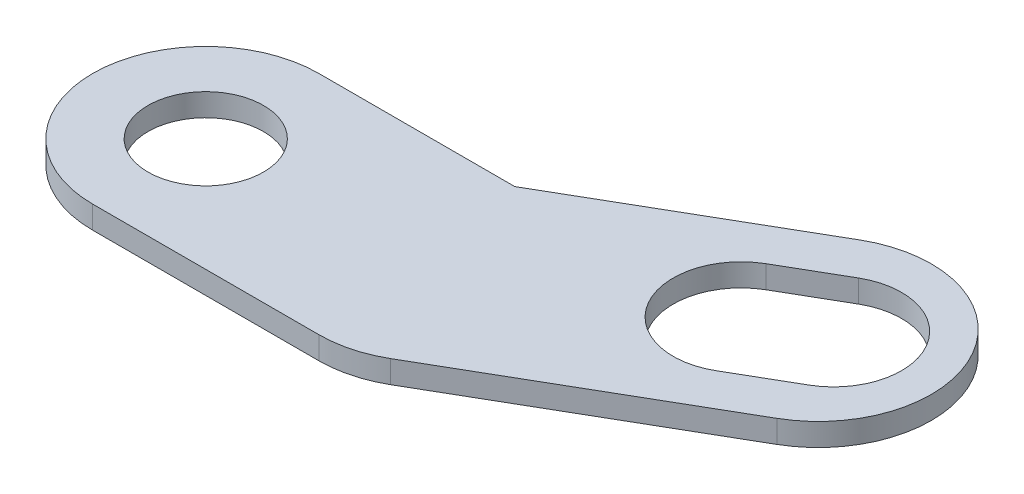
ISO-10303-21;
HEADER;
FILE_DESCRIPTION(('STEP AP214'),'2;1');
FILE_NAME('part.step','',(''),(''),'','','');
FILE_SCHEMA(('AUTOMOTIVE_DESIGN { 1 0 10303 214 1 1 1 1 }'));
ENDSEC;
DATA;
#1=APPLICATION_CONTEXT('core data for automotive mechanical design processes');
#2=APPLICATION_PROTOCOL_DEFINITION('international standard','automotive_design',2000,#1);
#3=PRODUCT_CONTEXT('',#1,'mechanical');
#4=PRODUCT('Part','Part','',(#3));
#5=PRODUCT_RELATED_PRODUCT_CATEGORY('part','',(#4));
#6=PRODUCT_DEFINITION_FORMATION('','',#4);
#7=PRODUCT_DEFINITION_CONTEXT('part definition',#1,'design');
#8=PRODUCT_DEFINITION('design','',#6,#7);
#9=PRODUCT_DEFINITION_SHAPE('','',#8);
#10=(LENGTH_UNIT() NAMED_UNIT(*) SI_UNIT(.MILLI.,.METRE.));
#11=(NAMED_UNIT(*) PLANE_ANGLE_UNIT() SI_UNIT($,.RADIAN.));
#12=(NAMED_UNIT(*) SI_UNIT($,.STERADIAN.) SOLID_ANGLE_UNIT());
#13=UNCERTAINTY_MEASURE_WITH_UNIT(LENGTH_MEASURE(1.E-05),#10,'distance_accuracy_value','');
#14=(GEOMETRIC_REPRESENTATION_CONTEXT(3) GLOBAL_UNCERTAINTY_ASSIGNED_CONTEXT((#13)) GLOBAL_UNIT_ASSIGNED_CONTEXT((#10,
#11,#12)) REPRESENTATION_CONTEXT('',''));
#15=CARTESIAN_POINT('',(0.,0.,0.));
#16=DIRECTION('',(0.,0.,1.));
#17=DIRECTION('',(1.,0.,0.));
#18=AXIS2_PLACEMENT_3D('',#15,#16,#17);
#19=CARTESIAN_POINT('',(10.6602540378444,1.,-5.00000000000002));
#20=DIRECTION('',(0.,1.,0.));
#21=DIRECTION('',(0.,0.,1.));
#22=AXIS2_PLACEMENT_3D('',#19,#20,#21);
#23=CYLINDRICAL_SURFACE('',#22,3.);
#24=DIRECTION('',(0.,1.,0.));
#25=VECTOR('',#24,1.);
#26=CARTESIAN_POINT('',(12.1602540378444,1.,-2.4019237886467));
#27=LINE('',#26,#25);
#28=CARTESIAN_POINT('',(12.1602540378444,0.,-2.4019237886467));
#29=VERTEX_POINT('',#28);
#30=CARTESIAN_POINT('',(12.1602540378444,1.,-2.4019237886467));
#31=VERTEX_POINT('',#30);
#32=EDGE_CURVE('E13',#29,#31,#27,.T.);
#33=ORIENTED_EDGE('',*,*,#32,.F.);
#34=CARTESIAN_POINT('',(10.6602540378444,0.,-5.00000000000002));
#35=DIRECTION('',(0.,1.,0.));
#36=DIRECTION('',(0.,0.,1.));
#37=AXIS2_PLACEMENT_3D('',#34,#35,#36);
#38=CIRCLE('',#37,3.);
#39=CARTESIAN_POINT('',(9.16025403784438,0.,-7.59807621135333));
#40=VERTEX_POINT('',#39);
#41=EDGE_CURVE('E126',#40,#29,#38,.T.);
#42=ORIENTED_EDGE('',*,*,#41,.F.);
#43=DIRECTION('',(0.,1.,0.));
#44=VECTOR('',#43,1.);
#45=CARTESIAN_POINT('',(9.16025403784438,1.,-7.59807621135333));
#46=LINE('',#45,#44);
#47=CARTESIAN_POINT('',(9.16025403784438,1.,-7.59807621135333));
#48=VERTEX_POINT('',#47);
#49=EDGE_CURVE('E60',#40,#48,#46,.T.);
#50=ORIENTED_EDGE('',*,*,#49,.T.);
#51=CARTESIAN_POINT('',(10.6602540378444,1.,-5.00000000000002));
#52=DIRECTION('',(0.,1.,0.));
#53=DIRECTION('',(0.,0.,1.));
#54=AXIS2_PLACEMENT_3D('',#51,#52,#53);
#55=CIRCLE('',#54,3.);
#56=EDGE_CURVE('E165',#48,#31,#55,.T.);
#57=ORIENTED_EDGE('',*,*,#56,.T.);
#58=EDGE_LOOP('',(#33,#42,#50,#57));
#59=FACE_BOUND('',#58,.T.);
#60=ADVANCED_FACE('F50',(#59),#23,.F.);
#61=CARTESIAN_POINT('',(-1.00000000000001,1.,-1.73205080756888));
#62=DIRECTION('',(0.500000000000001,0.,0.866025403784438));
#63=DIRECTION('',(0.866025403784438,0.,-0.500000000000001));
#64=AXIS2_PLACEMENT_3D('',#61,#62,#63);
#65=PLANE('',#64);
#66=ORIENTED_EDGE('',*,*,#49,.F.);
#67=DIRECTION('',(0.866025403784438,0.,-0.500000000000001));
#68=VECTOR('',#67,1.);
#69=CARTESIAN_POINT('',(-1.00000000000001,0.,-1.73205080756888));
#70=LINE('',#69,#68);
#71=CARTESIAN_POINT('',(11.7583302491977,0.,-9.09807621135333));
#72=VERTEX_POINT('',#71);
#73=EDGE_CURVE('E138',#40,#72,#70,.T.);
#74=ORIENTED_EDGE('',*,*,#73,.T.);
#75=DIRECTION('',(0.,1.,0.));
#76=VECTOR('',#75,1.);
#77=CARTESIAN_POINT('',(11.7583302491977,1.,-9.09807621135333));
#78=LINE('',#77,#76);
#79=CARTESIAN_POINT('',(11.7583302491977,1.,-9.09807621135333));
#80=VERTEX_POINT('',#79);
#81=EDGE_CURVE('E68',#72,#80,#78,.T.);
#82=ORIENTED_EDGE('',*,*,#81,.T.);
#83=DIRECTION('',(0.866025403784438,0.,-0.500000000000001));
#84=VECTOR('',#83,1.);
#85=CARTESIAN_POINT('',(-1.00000000000001,1.,-1.73205080756888));
#86=LINE('',#85,#84);
#87=EDGE_CURVE('E162',#48,#80,#86,.T.);
#88=ORIENTED_EDGE('',*,*,#87,.F.);
#89=EDGE_LOOP('',(#66,#74,#82,#88));
#90=FACE_BOUND('',#89,.T.);
#91=ADVANCED_FACE('F170',(#90),#65,.T.);
#92=CARTESIAN_POINT('',(13.2583302491977,1.,-6.50000000000002));
#93=DIRECTION('',(0.,1.,0.));
#94=DIRECTION('',(0.,0.,1.));
#95=AXIS2_PLACEMENT_3D('',#92,#93,#94);
#96=CYLINDRICAL_SURFACE('',#95,3.);
#97=ORIENTED_EDGE('',*,*,#81,.F.);
#98=CARTESIAN_POINT('',(13.2583302491977,0.,-6.50000000000002));
#99=DIRECTION('',(0.,1.,0.));
#100=DIRECTION('',(0.,0.,1.));
#101=AXIS2_PLACEMENT_3D('',#98,#99,#100);
#102=CIRCLE('',#101,3.);
#103=CARTESIAN_POINT('',(14.7583302491977,0.,-3.9019237886467));
#104=VERTEX_POINT('',#103);
#105=EDGE_CURVE('E125',#104,#72,#102,.T.);
#106=ORIENTED_EDGE('',*,*,#105,.F.);
#107=DIRECTION('',(0.,1.,0.));
#108=VECTOR('',#107,1.);
#109=CARTESIAN_POINT('',(14.7583302491977,1.,-3.9019237886467));
#110=LINE('',#109,#108);
#111=CARTESIAN_POINT('',(14.7583302491977,1.,-3.9019237886467));
#112=VERTEX_POINT('',#111);
#113=EDGE_CURVE('E54',#104,#112,#110,.T.);
#114=ORIENTED_EDGE('',*,*,#113,.T.);
#115=CARTESIAN_POINT('',(13.2583302491977,1.,-6.50000000000002));
#116=DIRECTION('',(0.,1.,0.));
#117=DIRECTION('',(0.,0.,1.));
#118=AXIS2_PLACEMENT_3D('',#115,#116,#117);
#119=CIRCLE('',#118,3.);
#120=EDGE_CURVE('E245',#112,#80,#119,.T.);
#121=ORIENTED_EDGE('',*,*,#120,.T.);
#122=EDGE_LOOP('',(#97,#106,#114,#121));
#123=FACE_BOUND('',#122,.T.);
#124=ADVANCED_FACE('F128',(#123),#96,.F.);
#125=CARTESIAN_POINT('',(3.00000000000001,1.,5.19615242270663));
#126=DIRECTION('',(0.500000000000001,0.,0.866025403784438));
#127=DIRECTION('',(0.866025403784438,0.,-0.500000000000001));
#128=AXIS2_PLACEMENT_3D('',#125,#126,#127);
#129=PLANE('',#128);
#130=DIRECTION('',(0.,1.,0.));
#131=VECTOR('',#130,1.);
#132=CARTESIAN_POINT('',(4.50000000000001,1.,4.33012701892219));
#133=LINE('',#132,#131);
#134=CARTESIAN_POINT('',(4.50000000000001,0.,4.33012701892219));
#135=VERTEX_POINT('',#134);
#136=CARTESIAN_POINT('',(4.50000000000001,1.,4.33012701892219));
#137=VERTEX_POINT('',#136);
#138=EDGE_CURVE('E120',#135,#137,#133,.T.);
#139=ORIENTED_EDGE('',*,*,#138,.F.);
#140=DIRECTION('',(0.866025403784438,0.,-0.500000000000001));
#141=VECTOR('',#140,1.);
#142=CARTESIAN_POINT('',(3.00000000000001,0.,5.19615242270663));
#143=LINE('',#142,#141);
#144=CARTESIAN_POINT('',(15.3253175473055,0.,-1.91987298107783));
#145=VERTEX_POINT('',#144);
#146=EDGE_CURVE('E185',#135,#145,#143,.T.);
#147=ORIENTED_EDGE('',*,*,#146,.T.);
#148=DIRECTION('',(0.,1.,0.));
#149=VECTOR('',#148,1.);
#150=CARTESIAN_POINT('',(15.3253175473055,1.,-1.91987298107783));
#151=LINE('',#150,#149);
#152=CARTESIAN_POINT('',(15.3253175473055,1.,-1.91987298107783));
#153=VERTEX_POINT('',#152);
#154=EDGE_CURVE('E155',#145,#153,#151,.T.);
#155=ORIENTED_EDGE('',*,*,#154,.T.);
#156=DIRECTION('',(0.866025403784438,0.,-0.500000000000001));
#157=VECTOR('',#156,1.);
#158=CARTESIAN_POINT('',(3.00000000000001,1.,5.19615242270663));
#159=LINE('',#158,#157);
#160=EDGE_CURVE('E225',#137,#153,#159,.T.);
#161=ORIENTED_EDGE('',*,*,#160,.F.);
#162=EDGE_LOOP('',(#139,#147,#155,#161));
#163=FACE_BOUND('',#162,.T.);
#164=ADVANCED_FACE('F224',(#163),#129,.T.);
#165=CARTESIAN_POINT('',(12.8253175473055,1.,-6.25000000000002));
#166=DIRECTION('',(0.,1.,0.));
#167=DIRECTION('',(0.,0.,1.));
#168=AXIS2_PLACEMENT_3D('',#165,#166,#167);
#169=CYLINDRICAL_SURFACE('',#168,5.);
#170=ORIENTED_EDGE('',*,*,#154,.F.);
#171=CARTESIAN_POINT('',(12.8253175473055,0.,-6.25000000000002));
#172=DIRECTION('',(0.,1.,0.));
#173=DIRECTION('',(0.,0.,1.));
#174=AXIS2_PLACEMENT_3D('',#171,#172,#173);
#175=CIRCLE('',#174,5.);
#176=CARTESIAN_POINT('',(10.3253175473055,0.,-10.5801270189222));
#177=VERTEX_POINT('',#176);
#178=EDGE_CURVE('E183',#145,#177,#175,.T.);
#179=ORIENTED_EDGE('',*,*,#178,.T.);
#180=DIRECTION('',(0.,1.,0.));
#181=VECTOR('',#180,1.);
#182=CARTESIAN_POINT('',(10.3253175473055,1.,-10.5801270189222));
#183=LINE('',#182,#181);
#184=CARTESIAN_POINT('',(10.3253175473055,1.,-10.5801270189222));
#185=VERTEX_POINT('',#184);
#186=EDGE_CURVE('E152',#177,#185,#183,.T.);
#187=ORIENTED_EDGE('',*,*,#186,.T.);
#188=CARTESIAN_POINT('',(12.8253175473055,1.,-6.25000000000002));
#189=DIRECTION('',(0.,1.,0.));
#190=DIRECTION('',(0.,0.,1.));
#191=AXIS2_PLACEMENT_3D('',#188,#189,#190);
#192=CIRCLE('',#191,5.);
#193=EDGE_CURVE('E231',#153,#185,#192,.T.);
#194=ORIENTED_EDGE('',*,*,#193,.F.);
#195=EDGE_LOOP('',(#170,#179,#187,#194));
#196=FACE_BOUND('',#195,.T.);
#197=ADVANCED_FACE('F235',(#196),#169,.T.);
#198=CARTESIAN_POINT('',(-2.00000000000001,1.,-3.46410161513775));
#199=DIRECTION('',(0.500000000000001,0.,0.866025403784438));
#200=DIRECTION('',(0.866025403784438,0.,-0.500000000000001));
#201=AXIS2_PLACEMENT_3D('',#198,#199,#200);
#202=PLANE('',#201);
#203=ORIENTED_EDGE('',*,*,#186,.F.);
#204=DIRECTION('',(0.866025403784438,0.,-0.500000000000001));
#205=VECTOR('',#204,1.);
#206=CARTESIAN_POINT('',(-2.00000000000001,0.,-3.46410161513775));
#207=LINE('',#206,#205);
#208=CARTESIAN_POINT('',(0.660254037844382,0.,-5.));
#209=VERTEX_POINT('',#208);
#210=EDGE_CURVE('E180',#209,#177,#207,.T.);
#211=ORIENTED_EDGE('',*,*,#210,.F.);
#212=DIRECTION('',(0.,1.,0.));
#213=VECTOR('',#212,1.);
#214=CARTESIAN_POINT('',(0.660254037844382,1.,-5.));
#215=LINE('',#214,#213);
#216=CARTESIAN_POINT('',(0.660254037844382,1.,-5.));
#217=VERTEX_POINT('',#216);
#218=EDGE_CURVE('E149',#209,#217,#215,.T.);
#219=ORIENTED_EDGE('',*,*,#218,.T.);
#220=DIRECTION('',(0.866025403784438,0.,-0.500000000000001));
#221=VECTOR('',#220,1.);
#222=CARTESIAN_POINT('',(-2.00000000000001,1.,-3.46410161513775));
#223=LINE('',#222,#221);
#224=EDGE_CURVE('E236',#217,#185,#223,.T.);
#225=ORIENTED_EDGE('',*,*,#224,.T.);
#226=EDGE_LOOP('',(#203,#211,#219,#225));
#227=FACE_BOUND('',#226,.T.);
#228=ADVANCED_FACE('F252',(#227),#202,.F.);
#229=CARTESIAN_POINT('',(0.,1.,-5.));
#230=DIRECTION('',(0.,0.,1.));
#231=DIRECTION('',(1.,0.,0.));
#232=AXIS2_PLACEMENT_3D('',#229,#230,#231);
#233=PLANE('',#232);
#234=ORIENTED_EDGE('',*,*,#218,.F.);
#235=DIRECTION('',(1.,0.,0.));
#236=VECTOR('',#235,1.);
#237=CARTESIAN_POINT('',(0.,0.,-5.));
#238=LINE('',#237,#236);
#239=CARTESIAN_POINT('',(-8.,0.,-5.));
#240=VERTEX_POINT('',#239);
#241=EDGE_CURVE('E132',#240,#209,#238,.T.);
#242=ORIENTED_EDGE('',*,*,#241,.F.);
#243=DIRECTION('',(0.,1.,0.));
#244=VECTOR('',#243,1.);
#245=CARTESIAN_POINT('',(-8.,1.,-5.));
#246=LINE('',#245,#244);
#247=CARTESIAN_POINT('',(-8.,1.,-5.));
#248=VERTEX_POINT('',#247);
#249=EDGE_CURVE('E145',#240,#248,#246,.T.);
#250=ORIENTED_EDGE('',*,*,#249,.T.);
#251=DIRECTION('',(1.,0.,0.));
#252=VECTOR('',#251,1.);
#253=CARTESIAN_POINT('',(0.,1.,-5.));
#254=LINE('',#253,#252);
#255=EDGE_CURVE('E238',#248,#217,#254,.T.);
#256=ORIENTED_EDGE('',*,*,#255,.T.);
#257=EDGE_LOOP('',(#234,#242,#250,#256));
#258=FACE_BOUND('',#257,.T.);
#259=ADVANCED_FACE('F248',(#258),#233,.F.);
#260=CARTESIAN_POINT('',(-8.,1.,0.));
#261=DIRECTION('',(0.,1.,0.));
#262=DIRECTION('',(0.,0.,1.));
#263=AXIS2_PLACEMENT_3D('',#260,#261,#262);
#264=CYLINDRICAL_SURFACE('',#263,5.);
#265=ORIENTED_EDGE('',*,*,#249,.F.);
#266=CARTESIAN_POINT('',(-8.,0.,0.));
#267=DIRECTION('',(0.,1.,0.));
#268=DIRECTION('',(0.,0.,1.));
#269=AXIS2_PLACEMENT_3D('',#266,#267,#268);
#270=CIRCLE('',#269,5.);
#271=CARTESIAN_POINT('',(-8.,0.,5.));
#272=VERTEX_POINT('',#271);
#273=EDGE_CURVE('E129',#240,#272,#270,.T.);
#274=ORIENTED_EDGE('',*,*,#273,.T.);
#275=DIRECTION('',(0.,1.,0.));
#276=VECTOR('',#275,1.);
#277=CARTESIAN_POINT('',(-8.,1.,5.));
#278=LINE('',#277,#276);
#279=CARTESIAN_POINT('',(-8.,1.,5.));
#280=VERTEX_POINT('',#279);
#281=EDGE_CURVE('E142',#272,#280,#278,.T.);
#282=ORIENTED_EDGE('',*,*,#281,.T.);
#283=CARTESIAN_POINT('',(-8.,1.,0.));
#284=DIRECTION('',(0.,1.,0.));
#285=DIRECTION('',(0.,0.,1.));
#286=AXIS2_PLACEMENT_3D('',#283,#284,#285);
#287=CIRCLE('',#286,5.);
#288=EDGE_CURVE('E210',#248,#280,#287,.T.);
#289=ORIENTED_EDGE('',*,*,#288,.F.);
#290=EDGE_LOOP('',(#265,#274,#282,#289));
#291=FACE_BOUND('',#290,.T.);
#292=ADVANCED_FACE('F208',(#291),#264,.T.);
#293=CARTESIAN_POINT('',(0.,1.,5.));
#294=DIRECTION('',(0.,0.,1.));
#295=DIRECTION('',(1.,0.,0.));
#296=AXIS2_PLACEMENT_3D('',#293,#294,#295);
#297=PLANE('',#296);
#298=ORIENTED_EDGE('',*,*,#281,.F.);
#299=DIRECTION('',(1.,0.,0.));
#300=VECTOR('',#299,1.);
#301=CARTESIAN_POINT('',(0.,0.,5.));
#302=LINE('',#301,#300);
#303=CARTESIAN_POINT('',(2.,0.,5.));
#304=VERTEX_POINT('',#303);
#305=EDGE_CURVE('E174',#272,#304,#302,.T.);
#306=ORIENTED_EDGE('',*,*,#305,.T.);
#307=DIRECTION('',(0.,1.,0.));
#308=VECTOR('',#307,1.);
#309=CARTESIAN_POINT('',(2.,1.,5.));
#310=LINE('',#309,#308);
#311=CARTESIAN_POINT('',(2.,1.,5.));
#312=VERTEX_POINT('',#311);
#313=EDGE_CURVE('E146',#304,#312,#310,.T.);
#314=ORIENTED_EDGE('',*,*,#313,.T.);
#315=DIRECTION('',(1.,0.,0.));
#316=VECTOR('',#315,1.);
#317=CARTESIAN_POINT('',(0.,1.,5.));
#318=LINE('',#317,#316);
#319=EDGE_CURVE('E140',#280,#312,#318,.T.);
#320=ORIENTED_EDGE('',*,*,#319,.F.);
#321=EDGE_LOOP('',(#298,#306,#314,#320));
#322=FACE_BOUND('',#321,.T.);
#323=ADVANCED_FACE('F201',(#322),#297,.T.);
#324=CARTESIAN_POINT('',(2.,1.,0.));
#325=DIRECTION('',(0.,1.,0.));
#326=DIRECTION('',(0.,0.,1.));
#327=AXIS2_PLACEMENT_3D('',#324,#325,#326);
#328=CYLINDRICAL_SURFACE('',#327,5.);
#329=CARTESIAN_POINT('',(2.,0.,0.));
#330=DIRECTION('',(0.,1.,0.));
#331=DIRECTION('',(0.,0.,1.));
#332=AXIS2_PLACEMENT_3D('',#329,#330,#331);
#333=CIRCLE('',#332,5.);
#334=EDGE_CURVE('E136',#304,#135,#333,.T.);
#335=ORIENTED_EDGE('',*,*,#334,.T.);
#336=ORIENTED_EDGE('',*,*,#138,.T.);
#337=CARTESIAN_POINT('',(2.,1.,0.));
#338=DIRECTION('',(0.,1.,0.));
#339=DIRECTION('',(0.,0.,1.));
#340=AXIS2_PLACEMENT_3D('',#337,#338,#339);
#341=CIRCLE('',#340,5.);
#342=EDGE_CURVE('E233',#312,#137,#341,.T.);
#343=ORIENTED_EDGE('',*,*,#342,.F.);
#344=ORIENTED_EDGE('',*,*,#313,.F.);
#345=EDGE_LOOP('',(#335,#336,#343,#344));
#346=FACE_BOUND('',#345,.T.);
#347=ADVANCED_FACE('F192',(#346),#328,.T.);
#348=CARTESIAN_POINT('',(2.00000000000001,1.,3.46410161513776));
#349=DIRECTION('',(0.500000000000002,0.,0.866025403784438));
#350=DIRECTION('',(0.866025403784438,0.,-0.500000000000002));
#351=AXIS2_PLACEMENT_3D('',#348,#349,#350);
#352=PLANE('',#351);
#353=DIRECTION('',(0.866025403784438,0.,-0.500000000000002));
#354=VECTOR('',#353,1.);
#355=CARTESIAN_POINT('',(2.00000000000001,0.,3.46410161513776));
#356=LINE('',#355,#354);
#357=EDGE_CURVE('E113',#29,#104,#356,.T.);
#358=ORIENTED_EDGE('',*,*,#357,.F.);
#359=ORIENTED_EDGE('',*,*,#32,.T.);
#360=DIRECTION('',(0.866025403784438,0.,-0.500000000000002));
#361=VECTOR('',#360,1.);
#362=CARTESIAN_POINT('',(2.00000000000001,1.,3.46410161513776));
#363=LINE('',#362,#361);
#364=EDGE_CURVE('E116',#31,#112,#363,.T.);
#365=ORIENTED_EDGE('',*,*,#364,.T.);
#366=ORIENTED_EDGE('',*,*,#113,.F.);
#367=EDGE_LOOP('',(#358,#359,#365,#366));
#368=FACE_BOUND('',#367,.T.);
#369=ADVANCED_FACE('F52',(#368),#352,.F.);
#370=CARTESIAN_POINT('',(0.,1.,0.));
#371=DIRECTION('',(0.,1.,0.));
#372=DIRECTION('',(0.,0.,1.));
#373=AXIS2_PLACEMENT_3D('',#370,#371,#372);
#374=PLANE('',#373);
#375=CARTESIAN_POINT('',(-8.,1.,0.));
#376=DIRECTION('',(0.,1.,0.));
#377=DIRECTION('',(0.,0.,1.));
#378=AXIS2_PLACEMENT_3D('',#375,#376,#377);
#379=CIRCLE('',#378,2.5527);
#380=CARTESIAN_POINT('',(-8.,1.,2.5527));
#381=VERTEX_POINT('',#380);
#382=EDGE_CURVE('E365',#381,#381,#379,.T.);
#383=ORIENTED_EDGE('',*,*,#382,.F.);
#384=EDGE_LOOP('',(#383));
#385=FACE_BOUND('',#384,.T.);
#386=ORIENTED_EDGE('',*,*,#319,.T.);
#387=ORIENTED_EDGE('',*,*,#342,.T.);
#388=ORIENTED_EDGE('',*,*,#160,.T.);
#389=ORIENTED_EDGE('',*,*,#193,.T.);
#390=ORIENTED_EDGE('',*,*,#224,.F.);
#391=ORIENTED_EDGE('',*,*,#255,.F.);
#392=ORIENTED_EDGE('',*,*,#288,.T.);
#393=EDGE_LOOP('',(#386,#387,#388,#389,#390,#391,#392));
#394=FACE_BOUND('',#393,.T.);
#395=ORIENTED_EDGE('',*,*,#120,.F.);
#396=ORIENTED_EDGE('',*,*,#364,.F.);
#397=ORIENTED_EDGE('',*,*,#56,.F.);
#398=ORIENTED_EDGE('',*,*,#87,.T.);
#399=EDGE_LOOP('',(#395,#396,#397,#398));
#400=FACE_BOUND('',#399,.T.);
#401=ADVANCED_FACE('F168',(#385,#394,#400),#374,.T.);
#402=CARTESIAN_POINT('',(0.,0.,0.));
#403=DIRECTION('',(0.,1.,0.));
#404=DIRECTION('',(0.,0.,1.));
#405=AXIS2_PLACEMENT_3D('',#402,#403,#404);
#406=PLANE('',#405);
#407=CARTESIAN_POINT('',(-8.,0.,0.));
#408=DIRECTION('',(0.,1.,0.));
#409=DIRECTION('',(0.,0.,1.));
#410=AXIS2_PLACEMENT_3D('',#407,#408,#409);
#411=CIRCLE('',#410,2.5527);
#412=CARTESIAN_POINT('',(-8.,0.,2.5527));
#413=VERTEX_POINT('',#412);
#414=EDGE_CURVE('E176',#413,#413,#411,.T.);
#415=ORIENTED_EDGE('',*,*,#414,.T.);
#416=EDGE_LOOP('',(#415));
#417=FACE_BOUND('',#416,.T.);
#418=ORIENTED_EDGE('',*,*,#305,.F.);
#419=ORIENTED_EDGE('',*,*,#273,.F.);
#420=ORIENTED_EDGE('',*,*,#241,.T.);
#421=ORIENTED_EDGE('',*,*,#210,.T.);
#422=ORIENTED_EDGE('',*,*,#178,.F.);
#423=ORIENTED_EDGE('',*,*,#146,.F.);
#424=ORIENTED_EDGE('',*,*,#334,.F.);
#425=EDGE_LOOP('',(#418,#419,#420,#421,#422,#423,#424));
#426=FACE_BOUND('',#425,.T.);
#427=ORIENTED_EDGE('',*,*,#105,.T.);
#428=ORIENTED_EDGE('',*,*,#73,.F.);
#429=ORIENTED_EDGE('',*,*,#41,.T.);
#430=ORIENTED_EDGE('',*,*,#357,.T.);
#431=EDGE_LOOP('',(#427,#428,#429,#430));
#432=FACE_BOUND('',#431,.T.);
#433=ADVANCED_FACE('F123',(#417,#426,#432),#406,.F.);
#434=CARTESIAN_POINT('',(-8.,1.,0.));
#435=DIRECTION('',(0.,1.,0.));
#436=DIRECTION('',(0.,0.,1.));
#437=AXIS2_PLACEMENT_3D('',#434,#435,#436);
#438=CYLINDRICAL_SURFACE('',#437,2.5527);
#439=ORIENTED_EDGE('',*,*,#414,.F.);
#440=EDGE_LOOP('',(#439));
#441=FACE_BOUND('',#440,.T.);
#442=ORIENTED_EDGE('',*,*,#382,.T.);
#443=EDGE_LOOP('',(#442));
#444=FACE_BOUND('',#443,.T.);
#445=ADVANCED_FACE('F345',(#441,#444),#438,.F.);
#446=CLOSED_SHELL('',(#60,#91,#124,#164,#197,#228,#259,#292,#323,#347,#369,#401,#433,#445));
#447=MANIFOLD_SOLID_BREP('B2',#446);
#448=ADVANCED_BREP_SHAPE_REPRESENTATION('',(#18,#447),#14);
#449=SHAPE_DEFINITION_REPRESENTATION(#9,#448);
ENDSEC;
END-ISO-10303-21;
